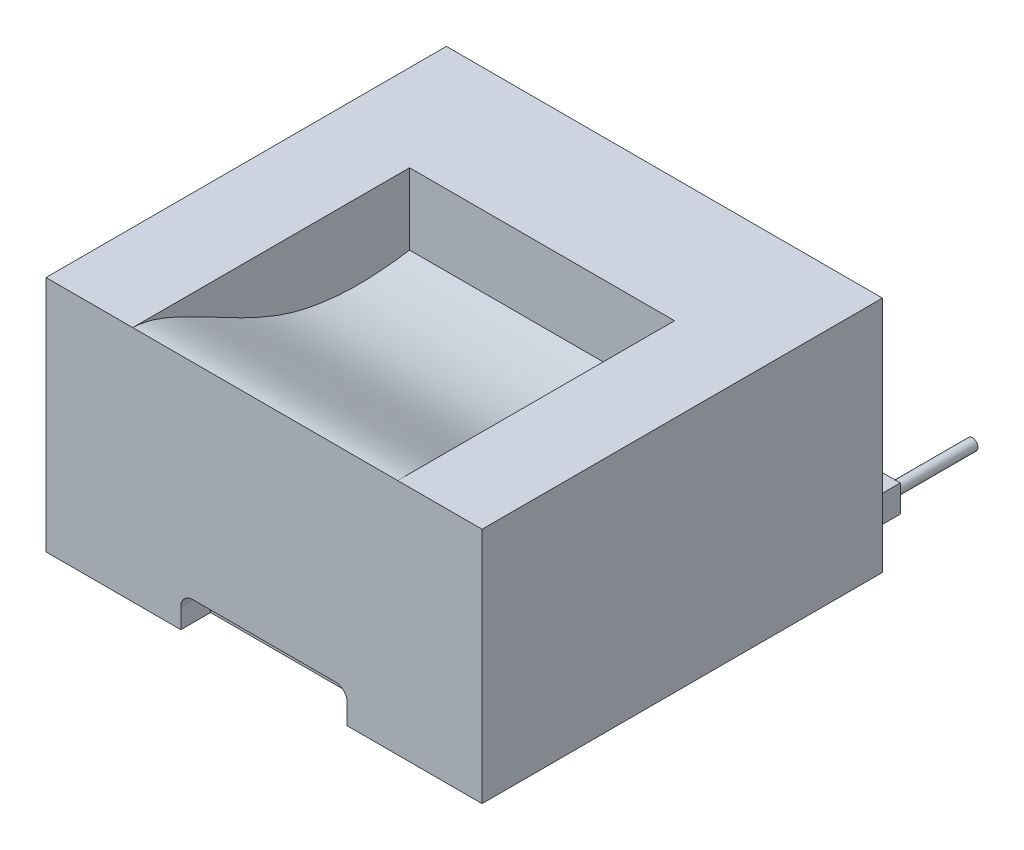
ISO-10303-21;
HEADER;
FILE_DESCRIPTION(('STEP AP214'),'2;1');
FILE_NAME('part.step','',(''),(''),'','','');
FILE_SCHEMA(('AUTOMOTIVE_DESIGN { 1 0 10303 214 1 1 1 1 }'));
ENDSEC;
DATA;
#1=APPLICATION_CONTEXT('core data for automotive mechanical design processes');
#2=APPLICATION_PROTOCOL_DEFINITION('international standard','automotive_design',2000,#1);
#3=PRODUCT_CONTEXT('',#1,'mechanical');
#4=PRODUCT('Part','Part','',(#3));
#5=PRODUCT_RELATED_PRODUCT_CATEGORY('part','',(#4));
#6=PRODUCT_DEFINITION_FORMATION('','',#4);
#7=PRODUCT_DEFINITION_CONTEXT('part definition',#1,'design');
#8=PRODUCT_DEFINITION('design','',#6,#7);
#9=PRODUCT_DEFINITION_SHAPE('','',#8);
#10=(LENGTH_UNIT() NAMED_UNIT(*) SI_UNIT(.MILLI.,.METRE.));
#11=(NAMED_UNIT(*) PLANE_ANGLE_UNIT() SI_UNIT($,.RADIAN.));
#12=(NAMED_UNIT(*) SI_UNIT($,.STERADIAN.) SOLID_ANGLE_UNIT());
#13=UNCERTAINTY_MEASURE_WITH_UNIT(LENGTH_MEASURE(1.E-05),#10,'distance_accuracy_value','');
#14=(GEOMETRIC_REPRESENTATION_CONTEXT(3) GLOBAL_UNCERTAINTY_ASSIGNED_CONTEXT((#13)) GLOBAL_UNIT_ASSIGNED_CONTEXT((#10,
#11,#12)) REPRESENTATION_CONTEXT('',''));
#15=CARTESIAN_POINT('',(0.,0.,0.));
#16=DIRECTION('',(0.,0.,1.));
#17=DIRECTION('',(1.,0.,0.));
#18=AXIS2_PLACEMENT_3D('',#15,#16,#17);
#19=CARTESIAN_POINT('',(0.,200.,0.));
#20=DIRECTION('',(0.,1.,0.));
#21=DIRECTION('',(0.,0.,1.));
#22=AXIS2_PLACEMENT_3D('',#19,#20,#21);
#23=PLANE('',#22);
#24=DIRECTION('',(1.,0.,0.));
#25=VECTOR('',#24,1.);
#26=CARTESIAN_POINT('',(-199.754231814552,200.,289.894753303738));
#27=LINE('',#26,#25);
#28=CARTESIAN_POINT('',(-199.754231814552,200.,289.894753303738));
#29=VERTEX_POINT('',#28);
#30=CARTESIAN_POINT('',(-126.754231814552,200.,289.894753303738));
#31=VERTEX_POINT('',#30);
#32=EDGE_CURVE('E361',#29,#31,#27,.T.);
#33=ORIENTED_EDGE('',*,*,#32,.T.);
#34=DIRECTION('',(0.,0.,1.));
#35=VECTOR('',#34,1.);
#36=CARTESIAN_POINT('',(-126.754231814552,200.,289.894753303738));
#37=LINE('',#36,#35);
#38=CARTESIAN_POINT('',(-126.754231814552,200.,56.8947533037381));
#39=VERTEX_POINT('',#38);
#40=EDGE_CURVE('E194',#39,#31,#37,.T.);
#41=ORIENTED_EDGE('',*,*,#40,.F.);
#42=DIRECTION('',(1.,0.,0.));
#43=VECTOR('',#42,1.);
#44=CARTESIAN_POINT('',(-126.754231814552,200.,56.8947533037381));
#45=LINE('',#44,#43);
#46=CARTESIAN_POINT('',(96.2457681854477,200.,56.8947533037381));
#47=VERTEX_POINT('',#46);
#48=EDGE_CURVE('E193',#39,#47,#45,.T.);
#49=ORIENTED_EDGE('',*,*,#48,.T.);
#50=DIRECTION('',(0.,0.,1.));
#51=VECTOR('',#50,1.);
#52=CARTESIAN_POINT('',(96.2457681854478,200.,289.894753303738));
#53=LINE('',#52,#51);
#54=CARTESIAN_POINT('',(96.2457681854477,200.,289.894753303738));
#55=VERTEX_POINT('',#54);
#56=EDGE_CURVE('E205',#47,#55,#53,.T.);
#57=ORIENTED_EDGE('',*,*,#56,.T.);
#58=CARTESIAN_POINT('',(167.245768185448,200.,289.894753303738));
#59=VERTEX_POINT('',#58);
#60=EDGE_CURVE('E366',#55,#59,#27,.T.);
#61=ORIENTED_EDGE('',*,*,#60,.T.);
#62=DIRECTION('',(0.,0.,-1.));
#63=VECTOR('',#62,1.);
#64=CARTESIAN_POINT('',(167.245768185448,200.,-47.1052466962619));
#65=LINE('',#64,#63);
#66=CARTESIAN_POINT('',(167.245768185448,200.,-47.1052466962619));
#67=VERTEX_POINT('',#66);
#68=EDGE_CURVE('E344',#59,#67,#65,.T.);
#69=ORIENTED_EDGE('',*,*,#68,.T.);
#70=DIRECTION('',(-1.,0.,0.));
#71=VECTOR('',#70,1.);
#72=CARTESIAN_POINT('',(-199.754231814552,200.,-47.1052466962619));
#73=LINE('',#72,#71);
#74=CARTESIAN_POINT('',(-199.754231814552,200.,-47.1052466962619));
#75=VERTEX_POINT('',#74);
#76=EDGE_CURVE('E336',#67,#75,#73,.T.);
#77=ORIENTED_EDGE('',*,*,#76,.T.);
#78=DIRECTION('',(0.,0.,1.));
#79=VECTOR('',#78,1.);
#80=CARTESIAN_POINT('',(-199.754231814552,200.,-47.1052466962619));
#81=LINE('',#80,#79);
#82=EDGE_CURVE('E331',#75,#29,#81,.T.);
#83=ORIENTED_EDGE('',*,*,#82,.T.);
#84=EDGE_LOOP('',(#33,#41,#49,#57,#61,#69,#77,#83));
#85=FACE_BOUND('',#84,.T.);
#86=ADVANCED_FACE('F40',(#85),#23,.T.);
#87=CARTESIAN_POINT('',(-199.754231814552,200.,-47.1052466962619));
#88=DIRECTION('',(0.,0.,1.));
#89=DIRECTION('',(1.,0.,0.));
#90=AXIS2_PLACEMENT_3D('',#87,#88,#89);
#91=PLANE('',#90);
#92=DIRECTION('',(0.,-1.,0.));
#93=VECTOR('',#92,1.);
#94=CARTESIAN_POINT('',(106.245768185448,0.,-47.1052466962619));
#95=LINE('',#94,#93);
#96=CARTESIAN_POINT('',(106.245768185448,47.,-47.1052466962619));
#97=VERTEX_POINT('',#96);
#98=CARTESIAN_POINT('',(106.245768185448,0.,-47.1052466962619));
#99=VERTEX_POINT('',#98);
#100=EDGE_CURVE('E355',#97,#99,#95,.T.);
#101=ORIENTED_EDGE('',*,*,#100,.F.);
#102=DIRECTION('',(1.,0.,0.));
#103=VECTOR('',#102,1.);
#104=CARTESIAN_POINT('',(106.245768185448,47.,-47.1052466962619));
#105=LINE('',#104,#103);
#106=CARTESIAN_POINT('',(-138.754231814552,47.,-47.1052466962619));
#107=VERTEX_POINT('',#106);
#108=EDGE_CURVE('E379',#107,#97,#105,.T.);
#109=ORIENTED_EDGE('',*,*,#108,.F.);
#110=DIRECTION('',(0.,1.,0.));
#111=VECTOR('',#110,1.);
#112=CARTESIAN_POINT('',(-138.754231814552,0.,-47.1052466962619));
#113=LINE('',#112,#111);
#114=CARTESIAN_POINT('',(-138.754231814552,0.,-47.1052466962619));
#115=VERTEX_POINT('',#114);
#116=EDGE_CURVE('E382',#115,#107,#113,.T.);
#117=ORIENTED_EDGE('',*,*,#116,.F.);
#118=DIRECTION('',(-1.,0.,0.));
#119=VECTOR('',#118,1.);
#120=CARTESIAN_POINT('',(-199.754231814552,0.,-47.1052466962619));
#121=LINE('',#120,#119);
#122=CARTESIAN_POINT('',(-199.754231814552,0.,-47.1052466962619));
#123=VERTEX_POINT('',#122);
#124=EDGE_CURVE('E323',#115,#123,#121,.T.);
#125=ORIENTED_EDGE('',*,*,#124,.T.);
#126=DIRECTION('',(0.,-1.,0.));
#127=VECTOR('',#126,1.);
#128=CARTESIAN_POINT('',(-199.754231814552,200.,-47.1052466962619));
#129=LINE('',#128,#127);
#130=EDGE_CURVE('E332',#75,#123,#129,.T.);
#131=ORIENTED_EDGE('',*,*,#130,.F.);
#132=ORIENTED_EDGE('',*,*,#76,.F.);
#133=DIRECTION('',(0.,-1.,0.));
#134=VECTOR('',#133,1.);
#135=CARTESIAN_POINT('',(167.245768185448,200.,-47.1052466962619));
#136=LINE('',#135,#134);
#137=CARTESIAN_POINT('',(167.245768185448,0.,-47.1052466962619));
#138=VERTEX_POINT('',#137);
#139=EDGE_CURVE('E335',#67,#138,#136,.T.);
#140=ORIENTED_EDGE('',*,*,#139,.T.);
#141=EDGE_CURVE('E329',#138,#99,#121,.T.);
#142=ORIENTED_EDGE('',*,*,#141,.T.);
#143=EDGE_LOOP('',(#101,#109,#117,#125,#131,#132,#140,#142));
#144=FACE_BOUND('',#143,.T.);
#145=DIRECTION('',(0.,-1.,0.));
#146=VECTOR('',#145,1.);
#147=CARTESIAN_POINT('',(147.245768185448,37.759447516328,-47.1052466962619));
#148=LINE('',#147,#146);
#149=CARTESIAN_POINT('',(147.245768185448,37.759447516328,-47.1052466962619));
#150=VERTEX_POINT('',#149);
#151=CARTESIAN_POINT('',(147.245768185448,15.,-47.1052466962619));
#152=VERTEX_POINT('',#151);
#153=EDGE_CURVE('E416',#150,#152,#148,.T.);
#154=ORIENTED_EDGE('',*,*,#153,.F.);
#155=DIRECTION('',(1.,0.,0.));
#156=VECTOR('',#155,1.);
#157=CARTESIAN_POINT('',(147.245768185448,37.759447516328,-47.1052466962619));
#158=LINE('',#157,#156);
#159=CARTESIAN_POINT('',(128.741820149761,37.759447516328,-47.1052466962619));
#160=VERTEX_POINT('',#159);
#161=EDGE_CURVE('E406',#160,#150,#158,.T.);
#162=ORIENTED_EDGE('',*,*,#161,.F.);
#163=DIRECTION('',(0.,1.,0.));
#164=VECTOR('',#163,1.);
#165=CARTESIAN_POINT('',(128.741820149761,37.759447516328,-47.1052466962619));
#166=LINE('',#165,#164);
#167=CARTESIAN_POINT('',(128.741820149761,15.,-47.1052466962619));
#168=VERTEX_POINT('',#167);
#169=EDGE_CURVE('E410',#168,#160,#166,.T.);
#170=ORIENTED_EDGE('',*,*,#169,.F.);
#171=DIRECTION('',(-1.,0.,0.));
#172=VECTOR('',#171,1.);
#173=CARTESIAN_POINT('',(147.245768185448,15.,-47.1052466962619));
#174=LINE('',#173,#172);
#175=EDGE_CURVE('E413',#152,#168,#174,.T.);
#176=ORIENTED_EDGE('',*,*,#175,.F.);
#177=EDGE_LOOP('',(#154,#162,#170,#176));
#178=FACE_BOUND('',#177,.T.);
#179=ADVANCED_FACE('F292',(#144,#178),#91,.F.);
#180=CARTESIAN_POINT('',(-199.754231814552,200.,-47.1052466962619));
#181=DIRECTION('',(1.,0.,0.));
#182=DIRECTION('',(0.,0.,-1.));
#183=AXIS2_PLACEMENT_3D('',#180,#181,#182);
#184=PLANE('',#183);
#185=DIRECTION('',(0.,0.,1.));
#186=VECTOR('',#185,1.);
#187=CARTESIAN_POINT('',(-199.754231814552,0.,-47.1052466962619));
#188=LINE('',#187,#186);
#189=CARTESIAN_POINT('',(-199.754231814552,0.,289.894753303738));
#190=VERTEX_POINT('',#189);
#191=EDGE_CURVE('E325',#123,#190,#188,.T.);
#192=ORIENTED_EDGE('',*,*,#191,.T.);
#193=DIRECTION('',(0.,-1.,0.));
#194=VECTOR('',#193,1.);
#195=CARTESIAN_POINT('',(-199.754231814552,200.,289.894753303738));
#196=LINE('',#195,#194);
#197=EDGE_CURVE('E44',#29,#190,#196,.T.);
#198=ORIENTED_EDGE('',*,*,#197,.F.);
#199=ORIENTED_EDGE('',*,*,#82,.F.);
#200=ORIENTED_EDGE('',*,*,#130,.T.);
#201=EDGE_LOOP('',(#192,#198,#199,#200));
#202=FACE_BOUND('',#201,.T.);
#203=ADVANCED_FACE('F42',(#202),#184,.F.);
#204=CARTESIAN_POINT('',(-199.754231814552,200.,289.894753303738));
#205=DIRECTION('',(0.,0.,-1.));
#206=DIRECTION('',(-1.,0.,0.));
#207=AXIS2_PLACEMENT_3D('',#204,#205,#206);
#208=PLANE('',#207);
#209=DIRECTION('',(1.,0.,0.));
#210=VECTOR('',#209,1.);
#211=CARTESIAN_POINT('',(-199.754231814552,0.,289.894753303738));
#212=LINE('',#211,#210);
#213=CARTESIAN_POINT('',(-86.2542318145522,0.,289.894753303738));
#214=VERTEX_POINT('',#213);
#215=EDGE_CURVE('E313',#190,#214,#212,.T.);
#216=ORIENTED_EDGE('',*,*,#215,.T.);
#217=DIRECTION('',(0.,-1.,0.));
#218=VECTOR('',#217,1.);
#219=CARTESIAN_POINT('',(-86.2542318145522,0.,289.894753303738));
#220=LINE('',#219,#218);
#221=CARTESIAN_POINT('',(-86.2542318145522,16.9999999999999,289.894753303738));
#222=VERTEX_POINT('',#221);
#223=EDGE_CURVE('E315',#222,#214,#220,.T.);
#224=ORIENTED_EDGE('',*,*,#223,.F.);
#225=CARTESIAN_POINT('',(-76.2542318145522,17.,289.894753303738));
#226=DIRECTION('',(0.,0.,1.));
#227=DIRECTION('',(-1.,0.,0.));
#228=AXIS2_PLACEMENT_3D('',#225,#226,#227);
#229=CIRCLE('',#228,10.);
#230=CARTESIAN_POINT('',(-76.2542318145522,27.,289.894753303738));
#231=VERTEX_POINT('',#230);
#232=EDGE_CURVE('E442',#231,#222,#229,.T.);
#233=ORIENTED_EDGE('',*,*,#232,.F.);
#234=DIRECTION('',(-1.,0.,0.));
#235=VECTOR('',#234,1.);
#236=CARTESIAN_POINT('',(-76.2542318145522,27.,289.894753303738));
#237=LINE('',#236,#235);
#238=CARTESIAN_POINT('',(43.7457681854477,27.,289.894753303738));
#239=VERTEX_POINT('',#238);
#240=EDGE_CURVE('E445',#239,#231,#237,.T.);
#241=ORIENTED_EDGE('',*,*,#240,.F.);
#242=CARTESIAN_POINT('',(43.7457681854478,17.,289.894753303738));
#243=DIRECTION('',(0.,0.,1.));
#244=DIRECTION('',(-1.,0.,0.));
#245=AXIS2_PLACEMENT_3D('',#242,#243,#244);
#246=CIRCLE('',#245,10.);
#247=CARTESIAN_POINT('',(53.7457681854478,16.9999999999999,289.894753303738));
#248=VERTEX_POINT('',#247);
#249=EDGE_CURVE('E448',#248,#239,#246,.T.);
#250=ORIENTED_EDGE('',*,*,#249,.F.);
#251=DIRECTION('',(0.,1.,0.));
#252=VECTOR('',#251,1.);
#253=CARTESIAN_POINT('',(53.7457681854478,0.,289.894753303738));
#254=LINE('',#253,#252);
#255=CARTESIAN_POINT('',(53.7457681854478,0.,289.894753303738));
#256=VERTEX_POINT('',#255);
#257=EDGE_CURVE('E451',#256,#248,#254,.T.);
#258=ORIENTED_EDGE('',*,*,#257,.F.);
#259=CARTESIAN_POINT('',(167.245768185448,0.,289.894753303738));
#260=VERTEX_POINT('',#259);
#261=EDGE_CURVE('E321',#256,#260,#212,.T.);
#262=ORIENTED_EDGE('',*,*,#261,.T.);
#263=DIRECTION('',(0.,-1.,0.));
#264=VECTOR('',#263,1.);
#265=CARTESIAN_POINT('',(167.245768185448,200.,289.894753303738));
#266=LINE('',#265,#264);
#267=EDGE_CURVE('E338',#59,#260,#266,.T.);
#268=ORIENTED_EDGE('',*,*,#267,.F.);
#269=ORIENTED_EDGE('',*,*,#60,.F.);
#270=DIRECTION('',(1.,0.,0.));
#271=VECTOR('',#270,1.);
#272=CARTESIAN_POINT('',(-126.754231814552,200.,289.894753303738));
#273=LINE('',#272,#271);
#274=EDGE_CURVE('E455',#31,#55,#273,.T.);
#275=ORIENTED_EDGE('',*,*,#274,.F.);
#276=ORIENTED_EDGE('',*,*,#32,.F.);
#277=ORIENTED_EDGE('',*,*,#197,.T.);
#278=EDGE_LOOP('',(#216,#224,#233,#241,#250,#258,#262,#268,#269,#275,#276,#277));
#279=FACE_BOUND('',#278,.T.);
#280=ADVANCED_FACE('F302',(#279),#208,.F.);
#281=CARTESIAN_POINT('',(167.245768185448,200.,-47.1052466962619));
#282=DIRECTION('',(-1.,0.,0.));
#283=DIRECTION('',(0.,0.,1.));
#284=AXIS2_PLACEMENT_3D('',#281,#282,#283);
#285=PLANE('',#284);
#286=DIRECTION('',(0.,0.,-1.));
#287=VECTOR('',#286,1.);
#288=CARTESIAN_POINT('',(167.245768185448,0.,-47.1052466962619));
#289=LINE('',#288,#287);
#290=EDGE_CURVE('E320',#260,#138,#289,.T.);
#291=ORIENTED_EDGE('',*,*,#290,.T.);
#292=ORIENTED_EDGE('',*,*,#139,.F.);
#293=ORIENTED_EDGE('',*,*,#68,.F.);
#294=ORIENTED_EDGE('',*,*,#267,.T.);
#295=EDGE_LOOP('',(#291,#292,#293,#294));
#296=FACE_BOUND('',#295,.T.);
#297=ADVANCED_FACE('F296',(#296),#285,.F.);
#298=CARTESIAN_POINT('',(0.,0.,0.));
#299=DIRECTION('',(0.,1.,0.));
#300=DIRECTION('',(0.,0.,1.));
#301=AXIS2_PLACEMENT_3D('',#298,#299,#300);
#302=PLANE('',#301);
#303=DIRECTION('',(1.,0.,0.));
#304=VECTOR('',#303,1.);
#305=CARTESIAN_POINT('',(-86.2542318145522,0.,264.894753303738));
#306=LINE('',#305,#304);
#307=CARTESIAN_POINT('',(-86.2542318145522,0.,264.894753303738));
#308=VERTEX_POINT('',#307);
#309=CARTESIAN_POINT('',(53.7457681854478,0.,264.894753303738));
#310=VERTEX_POINT('',#309);
#311=EDGE_CURVE('E466',#308,#310,#306,.T.);
#312=ORIENTED_EDGE('',*,*,#311,.F.);
#313=DIRECTION('',(0.,0.,1.));
#314=VECTOR('',#313,1.);
#315=CARTESIAN_POINT('',(-86.2542318145522,0.,264.894753303738));
#316=LINE('',#315,#314);
#317=EDGE_CURVE('E430',#308,#214,#316,.T.);
#318=ORIENTED_EDGE('',*,*,#317,.T.);
#319=ORIENTED_EDGE('',*,*,#215,.F.);
#320=ORIENTED_EDGE('',*,*,#191,.F.);
#321=ORIENTED_EDGE('',*,*,#124,.F.);
#322=DIRECTION('',(0.,0.,1.));
#323=VECTOR('',#322,1.);
#324=CARTESIAN_POINT('',(-138.754231814552,0.,-94.1052466962619));
#325=LINE('',#324,#323);
#326=CARTESIAN_POINT('',(-138.754231814552,0.,-94.1052466962619));
#327=VERTEX_POINT('',#326);
#328=EDGE_CURVE('E369',#327,#115,#325,.T.);
#329=ORIENTED_EDGE('',*,*,#328,.F.);
#330=DIRECTION('',(-1.,0.,0.));
#331=VECTOR('',#330,1.);
#332=CARTESIAN_POINT('',(106.245768185448,0.,-94.1052466962619));
#333=LINE('',#332,#331);
#334=CARTESIAN_POINT('',(106.245768185448,0.,-94.1052466962619));
#335=VERTEX_POINT('',#334);
#336=EDGE_CURVE('E390',#335,#327,#333,.T.);
#337=ORIENTED_EDGE('',*,*,#336,.F.);
#338=DIRECTION('',(0.,0.,1.));
#339=VECTOR('',#338,1.);
#340=CARTESIAN_POINT('',(106.245768185448,0.,-94.1052466962619));
#341=LINE('',#340,#339);
#342=EDGE_CURVE('E352',#335,#99,#341,.T.);
#343=ORIENTED_EDGE('',*,*,#342,.T.);
#344=ORIENTED_EDGE('',*,*,#141,.F.);
#345=ORIENTED_EDGE('',*,*,#290,.F.);
#346=ORIENTED_EDGE('',*,*,#261,.F.);
#347=DIRECTION('',(0.,0.,1.));
#348=VECTOR('',#347,1.);
#349=CARTESIAN_POINT('',(53.7457681854478,0.,264.894753303738));
#350=LINE('',#349,#348);
#351=EDGE_CURVE('E432',#310,#256,#350,.T.);
#352=ORIENTED_EDGE('',*,*,#351,.F.);
#353=EDGE_LOOP('',(#312,#318,#319,#320,#321,#329,#337,#343,#344,#345,#346,#352));
#354=FACE_BOUND('',#353,.T.);
#355=ADVANCED_FACE('F288',(#354),#302,.F.);
#356=CARTESIAN_POINT('',(106.245768185448,0.,-94.1052466962619));
#357=DIRECTION('',(-1.,0.,0.));
#358=DIRECTION('',(0.,-1.,0.));
#359=AXIS2_PLACEMENT_3D('',#356,#357,#358);
#360=PLANE('',#359);
#361=ORIENTED_EDGE('',*,*,#100,.T.);
#362=ORIENTED_EDGE('',*,*,#342,.F.);
#363=DIRECTION('',(0.,-1.,0.));
#364=VECTOR('',#363,1.);
#365=CARTESIAN_POINT('',(106.245768185448,0.,-94.1052466962619));
#366=LINE('',#365,#364);
#367=CARTESIAN_POINT('',(106.245768185448,47.,-94.1052466962619));
#368=VERTEX_POINT('',#367);
#369=EDGE_CURVE('E381',#368,#335,#366,.T.);
#370=ORIENTED_EDGE('',*,*,#369,.F.);
#371=DIRECTION('',(0.,0.,1.));
#372=VECTOR('',#371,1.);
#373=CARTESIAN_POINT('',(106.245768185448,47.,-94.1052466962619));
#374=LINE('',#373,#372);
#375=EDGE_CURVE('E375',#368,#97,#374,.T.);
#376=ORIENTED_EDGE('',*,*,#375,.T.);
#377=EDGE_LOOP('',(#361,#362,#370,#376));
#378=FACE_BOUND('',#377,.T.);
#379=ADVANCED_FACE('F284',(#378),#360,.F.);
#380=CARTESIAN_POINT('',(-138.754231814552,0.,-94.1052466962619));
#381=DIRECTION('',(1.,0.,0.));
#382=DIRECTION('',(0.,1.,0.));
#383=AXIS2_PLACEMENT_3D('',#380,#381,#382);
#384=PLANE('',#383);
#385=ORIENTED_EDGE('',*,*,#116,.T.);
#386=DIRECTION('',(0.,0.,1.));
#387=VECTOR('',#386,1.);
#388=CARTESIAN_POINT('',(-138.754231814552,47.,-94.1052466962619));
#389=LINE('',#388,#387);
#390=CARTESIAN_POINT('',(-138.754231814552,47.,-94.1052466962619));
#391=VERTEX_POINT('',#390);
#392=EDGE_CURVE('E372',#391,#107,#389,.T.);
#393=ORIENTED_EDGE('',*,*,#392,.F.);
#394=DIRECTION('',(0.,1.,0.));
#395=VECTOR('',#394,1.);
#396=CARTESIAN_POINT('',(-138.754231814552,0.,-94.1052466962619));
#397=LINE('',#396,#395);
#398=EDGE_CURVE('E388',#327,#391,#397,.T.);
#399=ORIENTED_EDGE('',*,*,#398,.F.);
#400=ORIENTED_EDGE('',*,*,#328,.T.);
#401=EDGE_LOOP('',(#385,#393,#399,#400));
#402=FACE_BOUND('',#401,.T.);
#403=ADVANCED_FACE('F280',(#402),#384,.F.);
#404=CARTESIAN_POINT('',(106.245768185448,47.,-94.1052466962619));
#405=DIRECTION('',(0.,-1.,0.));
#406=DIRECTION('',(1.,0.,0.));
#407=AXIS2_PLACEMENT_3D('',#404,#405,#406);
#408=PLANE('',#407);
#409=ORIENTED_EDGE('',*,*,#108,.T.);
#410=ORIENTED_EDGE('',*,*,#375,.F.);
#411=DIRECTION('',(1.,0.,0.));
#412=VECTOR('',#411,1.);
#413=CARTESIAN_POINT('',(106.245768185448,47.,-94.1052466962619));
#414=LINE('',#413,#412);
#415=EDGE_CURVE('E378',#391,#368,#414,.T.);
#416=ORIENTED_EDGE('',*,*,#415,.F.);
#417=ORIENTED_EDGE('',*,*,#392,.T.);
#418=EDGE_LOOP('',(#409,#410,#416,#417));
#419=FACE_BOUND('',#418,.T.);
#420=ADVANCED_FACE('F276',(#419),#408,.F.);
#421=CARTESIAN_POINT('',(0.,0.,-94.1052466962619));
#422=DIRECTION('',(0.,0.,1.));
#423=DIRECTION('',(1.,0.,0.));
#424=AXIS2_PLACEMENT_3D('',#421,#422,#423);
#425=PLANE('',#424);
#426=ORIENTED_EDGE('',*,*,#369,.T.);
#427=ORIENTED_EDGE('',*,*,#336,.T.);
#428=ORIENTED_EDGE('',*,*,#398,.T.);
#429=ORIENTED_EDGE('',*,*,#415,.T.);
#430=EDGE_LOOP('',(#426,#427,#428,#429));
#431=FACE_BOUND('',#430,.T.);
#432=ADVANCED_FACE('F272',(#431),#425,.F.);
#433=CARTESIAN_POINT('',(147.245768185448,37.759447516328,-82.1052466962619));
#434=DIRECTION('',(-1.,0.,0.));
#435=DIRECTION('',(0.,0.,1.));
#436=AXIS2_PLACEMENT_3D('',#433,#434,#435);
#437=PLANE('',#436);
#438=ORIENTED_EDGE('',*,*,#153,.T.);
#439=DIRECTION('',(0.,0.,1.));
#440=VECTOR('',#439,1.);
#441=CARTESIAN_POINT('',(147.245768185448,15.,-82.1052466962619));
#442=LINE('',#441,#440);
#443=CARTESIAN_POINT('',(147.245768185448,15.,-82.1052466962619));
#444=VERTEX_POINT('',#443);
#445=EDGE_CURVE('E386',#444,#152,#442,.T.);
#446=ORIENTED_EDGE('',*,*,#445,.F.);
#447=DIRECTION('',(0.,-1.,0.));
#448=VECTOR('',#447,1.);
#449=CARTESIAN_POINT('',(147.245768185448,37.759447516328,-82.1052466962619));
#450=LINE('',#449,#448);
#451=CARTESIAN_POINT('',(147.245768185448,37.759447516328,-82.1052466962619));
#452=VERTEX_POINT('',#451);
#453=EDGE_CURVE('E409',#452,#444,#450,.T.);
#454=ORIENTED_EDGE('',*,*,#453,.F.);
#455=DIRECTION('',(0.,0.,1.));
#456=VECTOR('',#455,1.);
#457=CARTESIAN_POINT('',(147.245768185448,37.759447516328,-82.1052466962619));
#458=LINE('',#457,#456);
#459=EDGE_CURVE('E402',#452,#150,#458,.T.);
#460=ORIENTED_EDGE('',*,*,#459,.T.);
#461=EDGE_LOOP('',(#438,#446,#454,#460));
#462=FACE_BOUND('',#461,.T.);
#463=ADVANCED_FACE('F268',(#462),#437,.F.);
#464=CARTESIAN_POINT('',(147.245768185448,15.,-82.1052466962619));
#465=DIRECTION('',(0.,1.,0.));
#466=DIRECTION('',(0.,0.,1.));
#467=AXIS2_PLACEMENT_3D('',#464,#465,#466);
#468=PLANE('',#467);
#469=ORIENTED_EDGE('',*,*,#175,.T.);
#470=DIRECTION('',(0.,0.,1.));
#471=VECTOR('',#470,1.);
#472=CARTESIAN_POINT('',(128.741820149761,15.,-82.1052466962619));
#473=LINE('',#472,#471);
#474=CARTESIAN_POINT('',(128.741820149761,15.,-82.1052466962619));
#475=VERTEX_POINT('',#474);
#476=EDGE_CURVE('E396',#475,#168,#473,.T.);
#477=ORIENTED_EDGE('',*,*,#476,.F.);
#478=DIRECTION('',(-1.,0.,0.));
#479=VECTOR('',#478,1.);
#480=CARTESIAN_POINT('',(147.245768185448,15.,-82.1052466962619));
#481=LINE('',#480,#479);
#482=EDGE_CURVE('E423',#444,#475,#481,.T.);
#483=ORIENTED_EDGE('',*,*,#482,.F.);
#484=ORIENTED_EDGE('',*,*,#445,.T.);
#485=EDGE_LOOP('',(#469,#477,#483,#484));
#486=FACE_BOUND('',#485,.T.);
#487=ADVANCED_FACE('F264',(#486),#468,.F.);
#488=CARTESIAN_POINT('',(128.741820149761,37.759447516328,-82.1052466962619));
#489=DIRECTION('',(1.,0.,0.));
#490=DIRECTION('',(0.,0.,-1.));
#491=AXIS2_PLACEMENT_3D('',#488,#489,#490);
#492=PLANE('',#491);
#493=ORIENTED_EDGE('',*,*,#169,.T.);
#494=DIRECTION('',(0.,0.,1.));
#495=VECTOR('',#494,1.);
#496=CARTESIAN_POINT('',(128.741820149761,37.759447516328,-82.1052466962619));
#497=LINE('',#496,#495);
#498=CARTESIAN_POINT('',(128.741820149761,37.759447516328,-82.1052466962619));
#499=VERTEX_POINT('',#498);
#500=EDGE_CURVE('E399',#499,#160,#497,.T.);
#501=ORIENTED_EDGE('',*,*,#500,.F.);
#502=DIRECTION('',(0.,1.,0.));
#503=VECTOR('',#502,1.);
#504=CARTESIAN_POINT('',(128.741820149761,37.759447516328,-82.1052466962619));
#505=LINE('',#504,#503);
#506=EDGE_CURVE('E421',#475,#499,#505,.T.);
#507=ORIENTED_EDGE('',*,*,#506,.F.);
#508=ORIENTED_EDGE('',*,*,#476,.T.);
#509=EDGE_LOOP('',(#493,#501,#507,#508));
#510=FACE_BOUND('',#509,.T.);
#511=ADVANCED_FACE('F260',(#510),#492,.F.);
#512=CARTESIAN_POINT('',(147.245768185448,37.759447516328,-82.1052466962619));
#513=DIRECTION('',(0.,-1.,0.));
#514=DIRECTION('',(0.,0.,-1.));
#515=AXIS2_PLACEMENT_3D('',#512,#513,#514);
#516=PLANE('',#515);
#517=ORIENTED_EDGE('',*,*,#161,.T.);
#518=ORIENTED_EDGE('',*,*,#459,.F.);
#519=DIRECTION('',(1.,0.,0.));
#520=VECTOR('',#519,1.);
#521=CARTESIAN_POINT('',(147.245768185448,37.759447516328,-82.1052466962619));
#522=LINE('',#521,#520);
#523=EDGE_CURVE('E405',#499,#452,#522,.T.);
#524=ORIENTED_EDGE('',*,*,#523,.F.);
#525=ORIENTED_EDGE('',*,*,#500,.T.);
#526=EDGE_LOOP('',(#517,#518,#524,#525));
#527=FACE_BOUND('',#526,.T.);
#528=ADVANCED_FACE('F256',(#527),#516,.F.);
#529=CARTESIAN_POINT('',(0.,0.,-82.1052466962619));
#530=DIRECTION('',(0.,0.,-1.));
#531=DIRECTION('',(-1.,0.,0.));
#532=AXIS2_PLACEMENT_3D('',#529,#530,#531);
#533=PLANE('',#532);
#534=CARTESIAN_POINT('',(137.993794167604,26.379723758164,-82.1052466962619));
#535=DIRECTION('',(0.,0.,-1.));
#536=DIRECTION('',(-1.,0.,0.));
#537=AXIS2_PLACEMENT_3D('',#534,#535,#536);
#538=CIRCLE('',#537,4.68912263757735);
#539=CARTESIAN_POINT('',(133.304671530027,26.379723758164,-82.1052466962619));
#540=VERTEX_POINT('',#539);
#541=EDGE_CURVE('E11',#540,#540,#538,.T.);
#542=ORIENTED_EDGE('',*,*,#541,.F.);
#543=EDGE_LOOP('',(#542));
#544=FACE_BOUND('',#543,.T.);
#545=ORIENTED_EDGE('',*,*,#453,.T.);
#546=ORIENTED_EDGE('',*,*,#482,.T.);
#547=ORIENTED_EDGE('',*,*,#506,.T.);
#548=ORIENTED_EDGE('',*,*,#523,.T.);
#549=EDGE_LOOP('',(#545,#546,#547,#548));
#550=FACE_BOUND('',#549,.T.);
#551=ADVANCED_FACE('F252',(#544,#550),#533,.T.);
#552=CARTESIAN_POINT('',(137.993794167604,26.379723758164,-152.105246696262));
#553=DIRECTION('',(0.,0.,1.));
#554=DIRECTION('',(1.,0.,0.));
#555=AXIS2_PLACEMENT_3D('',#552,#553,#554);
#556=CYLINDRICAL_SURFACE('',#555,4.68912263757735);
#557=CARTESIAN_POINT('',(137.993794167604,26.379723758164,-152.105246696262));
#558=DIRECTION('',(0.,0.,-1.));
#559=DIRECTION('',(-1.,0.,0.));
#560=AXIS2_PLACEMENT_3D('',#557,#558,#559);
#561=CIRCLE('',#560,4.68912263757735);
#562=CARTESIAN_POINT('',(133.304671530027,26.379723758164,-152.105246696262));
#563=VERTEX_POINT('',#562);
#564=EDGE_CURVE('E419',#563,#563,#561,.T.);
#565=ORIENTED_EDGE('',*,*,#564,.F.);
#566=EDGE_LOOP('',(#565));
#567=FACE_BOUND('',#566,.T.);
#568=ORIENTED_EDGE('',*,*,#541,.T.);
#569=EDGE_LOOP('',(#568));
#570=FACE_BOUND('',#569,.T.);
#571=ADVANCED_FACE('F248',(#567,#570),#556,.T.);
#572=CARTESIAN_POINT('',(137.993794167604,26.379723758164,-152.105246696262));
#573=DIRECTION('',(0.,0.,-1.));
#574=DIRECTION('',(-1.,0.,0.));
#575=AXIS2_PLACEMENT_3D('',#572,#573,#574);
#576=PLANE('',#575);
#577=ORIENTED_EDGE('',*,*,#564,.T.);
#578=EDGE_LOOP('',(#577));
#579=FACE_BOUND('',#578,.T.);
#580=ADVANCED_FACE('F244',(#579),#576,.T.);
#581=CARTESIAN_POINT('',(-86.2542318145522,0.,264.894753303738));
#582=DIRECTION('',(-1.,0.,0.));
#583=DIRECTION('',(0.,0.,1.));
#584=AXIS2_PLACEMENT_3D('',#581,#582,#583);
#585=PLANE('',#584);
#586=ORIENTED_EDGE('',*,*,#223,.T.);
#587=ORIENTED_EDGE('',*,*,#317,.F.);
#588=DIRECTION('',(0.,-1.,0.));
#589=VECTOR('',#588,1.);
#590=CARTESIAN_POINT('',(-86.2542318145522,0.,264.894753303738));
#591=LINE('',#590,#589);
#592=CARTESIAN_POINT('',(-86.2542318145522,16.9999999999999,264.894753303738));
#593=VERTEX_POINT('',#592);
#594=EDGE_CURVE('E64',#593,#308,#591,.T.);
#595=ORIENTED_EDGE('',*,*,#594,.F.);
#596=DIRECTION('',(0.,0.,1.));
#597=VECTOR('',#596,1.);
#598=CARTESIAN_POINT('',(-86.2542318145522,16.9999999999999,264.894753303738));
#599=LINE('',#598,#597);
#600=EDGE_CURVE('E429',#593,#222,#599,.T.);
#601=ORIENTED_EDGE('',*,*,#600,.T.);
#602=EDGE_LOOP('',(#586,#587,#595,#601));
#603=FACE_BOUND('',#602,.T.);
#604=ADVANCED_FACE('F230',(#603),#585,.F.);
#605=CARTESIAN_POINT('',(-76.2542318145522,17.,264.894753303738));
#606=DIRECTION('',(0.,0.,1.));
#607=DIRECTION('',(1.,0.,0.));
#608=AXIS2_PLACEMENT_3D('',#605,#606,#607);
#609=CYLINDRICAL_SURFACE('',#608,10.);
#610=ORIENTED_EDGE('',*,*,#232,.T.);
#611=ORIENTED_EDGE('',*,*,#600,.F.);
#612=CARTESIAN_POINT('',(-76.2542318145522,17.,264.894753303738));
#613=DIRECTION('',(0.,0.,1.));
#614=DIRECTION('',(-1.,0.,0.));
#615=AXIS2_PLACEMENT_3D('',#612,#613,#614);
#616=CIRCLE('',#615,10.);
#617=CARTESIAN_POINT('',(-76.2542318145522,27.,264.894753303738));
#618=VERTEX_POINT('',#617);
#619=EDGE_CURVE('E433',#618,#593,#616,.T.);
#620=ORIENTED_EDGE('',*,*,#619,.F.);
#621=DIRECTION('',(0.,0.,1.));
#622=VECTOR('',#621,1.);
#623=CARTESIAN_POINT('',(-76.2542318145522,27.,264.894753303738));
#624=LINE('',#623,#622);
#625=EDGE_CURVE('E439',#618,#231,#624,.T.);
#626=ORIENTED_EDGE('',*,*,#625,.T.);
#627=EDGE_LOOP('',(#610,#611,#620,#626));
#628=FACE_BOUND('',#627,.T.);
#629=ADVANCED_FACE('F226',(#628),#609,.F.);
#630=CARTESIAN_POINT('',(-76.2542318145522,27.,264.894753303738));
#631=DIRECTION('',(0.,1.,0.));
#632=DIRECTION('',(0.,0.,1.));
#633=AXIS2_PLACEMENT_3D('',#630,#631,#632);
#634=PLANE('',#633);
#635=ORIENTED_EDGE('',*,*,#240,.T.);
#636=ORIENTED_EDGE('',*,*,#625,.F.);
#637=DIRECTION('',(-1.,0.,0.));
#638=VECTOR('',#637,1.);
#639=CARTESIAN_POINT('',(-76.2542318145522,27.,264.894753303738));
#640=LINE('',#639,#638);
#641=CARTESIAN_POINT('',(43.7457681854477,27.,264.894753303738));
#642=VERTEX_POINT('',#641);
#643=EDGE_CURVE('E457',#642,#618,#640,.T.);
#644=ORIENTED_EDGE('',*,*,#643,.F.);
#645=DIRECTION('',(0.,0.,1.));
#646=VECTOR('',#645,1.);
#647=CARTESIAN_POINT('',(43.7457681854477,27.,264.894753303738));
#648=LINE('',#647,#646);
#649=EDGE_CURVE('E437',#642,#239,#648,.T.);
#650=ORIENTED_EDGE('',*,*,#649,.T.);
#651=EDGE_LOOP('',(#635,#636,#644,#650));
#652=FACE_BOUND('',#651,.T.);
#653=ADVANCED_FACE('F229',(#652),#634,.F.);
#654=CARTESIAN_POINT('',(43.7457681854478,17.,264.894753303738));
#655=DIRECTION('',(0.,0.,1.));
#656=DIRECTION('',(1.,0.,0.));
#657=AXIS2_PLACEMENT_3D('',#654,#655,#656);
#658=CYLINDRICAL_SURFACE('',#657,10.);
#659=ORIENTED_EDGE('',*,*,#249,.T.);
#660=ORIENTED_EDGE('',*,*,#649,.F.);
#661=CARTESIAN_POINT('',(43.7457681854478,17.,264.894753303738));
#662=DIRECTION('',(0.,0.,1.));
#663=DIRECTION('',(-1.,0.,0.));
#664=AXIS2_PLACEMENT_3D('',#661,#662,#663);
#665=CIRCLE('',#664,10.);
#666=CARTESIAN_POINT('',(53.7457681854478,16.9999999999999,264.894753303738));
#667=VERTEX_POINT('',#666);
#668=EDGE_CURVE('E460',#667,#642,#665,.T.);
#669=ORIENTED_EDGE('',*,*,#668,.F.);
#670=DIRECTION('',(0.,0.,1.));
#671=VECTOR('',#670,1.);
#672=CARTESIAN_POINT('',(53.7457681854478,16.9999999999999,264.894753303738));
#673=LINE('',#672,#671);
#674=EDGE_CURVE('E435',#667,#248,#673,.T.);
#675=ORIENTED_EDGE('',*,*,#674,.T.);
#676=EDGE_LOOP('',(#659,#660,#669,#675));
#677=FACE_BOUND('',#676,.T.);
#678=ADVANCED_FACE('F234',(#677),#658,.F.);
#679=CARTESIAN_POINT('',(53.7457681854478,0.,264.894753303738));
#680=DIRECTION('',(1.,0.,0.));
#681=DIRECTION('',(0.,0.,-1.));
#682=AXIS2_PLACEMENT_3D('',#679,#680,#681);
#683=PLANE('',#682);
#684=ORIENTED_EDGE('',*,*,#257,.T.);
#685=ORIENTED_EDGE('',*,*,#674,.F.);
#686=DIRECTION('',(0.,1.,0.));
#687=VECTOR('',#686,1.);
#688=CARTESIAN_POINT('',(53.7457681854478,0.,264.894753303738));
#689=LINE('',#688,#687);
#690=EDGE_CURVE('E463',#310,#667,#689,.T.);
#691=ORIENTED_EDGE('',*,*,#690,.F.);
#692=ORIENTED_EDGE('',*,*,#351,.T.);
#693=EDGE_LOOP('',(#684,#685,#691,#692));
#694=FACE_BOUND('',#693,.T.);
#695=ADVANCED_FACE('F225',(#694),#683,.F.);
#696=CARTESIAN_POINT('',(-76.2542318145522,17.,264.894753303738));
#697=DIRECTION('',(0.,0.,-1.));
#698=DIRECTION('',(-1.,0.,0.));
#699=AXIS2_PLACEMENT_3D('',#696,#697,#698);
#700=PLANE('',#699);
#701=ORIENTED_EDGE('',*,*,#594,.T.);
#702=ORIENTED_EDGE('',*,*,#311,.T.);
#703=ORIENTED_EDGE('',*,*,#690,.T.);
#704=ORIENTED_EDGE('',*,*,#668,.T.);
#705=ORIENTED_EDGE('',*,*,#643,.T.);
#706=ORIENTED_EDGE('',*,*,#619,.T.);
#707=EDGE_LOOP('',(#701,#702,#703,#704,#705,#706));
#708=FACE_BOUND('',#707,.T.);
#709=ADVANCED_FACE('F221',(#708),#700,.F.);
#710=CARTESIAN_POINT('',(-126.754231814552,200.,289.894753303738));
#711=CARTESIAN_POINT('',(-126.754231814552,199.483070544366,255.905913973019));
#712=CARTESIAN_POINT('',(-126.754231814552,150.542684270892,195.675702753632));
#713=CARTESIAN_POINT('',(-126.754231814552,134.680175733057,111.630124678743));
#714=CARTESIAN_POINT('',(-126.754231814552,135.886366382212,84.5905039348724));
#715=CARTESIAN_POINT('',(-126.754231814552,140.,56.8947533037379));
#716=B_SPLINE_CURVE_WITH_KNOTS('',3,(#710,#711,#712,#713,#714,#715),.UNSPECIFIED.,.F.,.F.,(4,1,
1,4),(0.,0.585078831127396,0.685078831127396,1.),.UNSPECIFIED.);
#717=DIRECTION('',(1.,0.,0.));
#718=VECTOR('',#717,1.);
#719=SURFACE_OF_LINEAR_EXTRUSION('',#716,#718);
#720=CARTESIAN_POINT('',(96.2457681854478,200.,289.894753303738));
#721=CARTESIAN_POINT('',(96.2457681854478,199.483070544366,255.905913973019));
#722=CARTESIAN_POINT('',(96.2457681854477,150.542684270892,195.675702753632));
#723=CARTESIAN_POINT('',(96.2457681854477,134.680175733057,111.630124678743));
#724=CARTESIAN_POINT('',(96.2457681854477,135.886366382212,84.5905039348724));
#725=CARTESIAN_POINT('',(96.2457681854477,140.,56.8947533037379));
#726=B_SPLINE_CURVE_WITH_KNOTS('',3,(#720,#721,#722,#723,#724,#725),.UNSPECIFIED.,.F.,.F.,(4,1,
1,4),(0.,0.585078831127396,0.685078831127396,1.),.UNSPECIFIED.);
#727=CARTESIAN_POINT('',(96.2457681854477,140.,56.8947533037381));
#728=VERTEX_POINT('',#727);
#729=EDGE_CURVE('E56',#55,#728,#726,.T.);
#730=ORIENTED_EDGE('',*,*,#729,.T.);
#731=DIRECTION('',(1.,0.,0.));
#732=VECTOR('',#731,1.);
#733=CARTESIAN_POINT('',(-126.754231814552,140.,56.8947533037381));
#734=LINE('',#733,#732);
#735=CARTESIAN_POINT('',(-126.754231814552,140.,56.8947533037381));
#736=VERTEX_POINT('',#735);
#737=EDGE_CURVE('E186',#736,#728,#734,.T.);
#738=ORIENTED_EDGE('',*,*,#737,.F.);
#739=EDGE_CURVE('E190',#31,#736,#716,.T.);
#740=ORIENTED_EDGE('',*,*,#739,.F.);
#741=ORIENTED_EDGE('',*,*,#274,.T.);
#742=EDGE_LOOP('',(#730,#738,#740,#741));
#743=FACE_BOUND('',#742,.T.);
#744=ADVANCED_FACE('F188',(#743),#719,.F.);
#745=CARTESIAN_POINT('',(-126.754231814552,200.,56.8947533037381));
#746=DIRECTION('',(0.,0.,-1.));
#747=DIRECTION('',(-1.,0.,0.));
#748=AXIS2_PLACEMENT_3D('',#745,#746,#747);
#749=PLANE('',#748);
#750=DIRECTION('',(0.,1.,0.));
#751=VECTOR('',#750,1.);
#752=CARTESIAN_POINT('',(96.2457681854477,200.,56.8947533037381));
#753=LINE('',#752,#751);
#754=EDGE_CURVE('E208',#728,#47,#753,.T.);
#755=ORIENTED_EDGE('',*,*,#754,.T.);
#756=ORIENTED_EDGE('',*,*,#48,.F.);
#757=DIRECTION('',(0.,1.,0.));
#758=VECTOR('',#757,1.);
#759=CARTESIAN_POINT('',(-126.754231814552,200.,56.8947533037381));
#760=LINE('',#759,#758);
#761=EDGE_CURVE('E197',#736,#39,#760,.T.);
#762=ORIENTED_EDGE('',*,*,#761,.F.);
#763=ORIENTED_EDGE('',*,*,#737,.T.);
#764=EDGE_LOOP('',(#755,#756,#762,#763));
#765=FACE_BOUND('',#764,.T.);
#766=ADVANCED_FACE('F198',(#765),#749,.F.);
#767=CARTESIAN_POINT('',(-126.754231814552,151.327835665084,176.622344302375));
#768=DIRECTION('',(1.,0.,0.));
#769=DIRECTION('',(0.,1.,0.));
#770=AXIS2_PLACEMENT_3D('',#767,#768,#769);
#771=PLANE('',#770);
#772=ORIENTED_EDGE('',*,*,#739,.T.);
#773=ORIENTED_EDGE('',*,*,#761,.T.);
#774=ORIENTED_EDGE('',*,*,#40,.T.);
#775=EDGE_LOOP('',(#772,#773,#774));
#776=FACE_BOUND('',#775,.T.);
#777=ADVANCED_FACE('F203',(#776),#771,.T.);
#778=CARTESIAN_POINT('',(96.2457681854477,151.327835665084,176.622344302375));
#779=DIRECTION('',(1.,0.,0.));
#780=DIRECTION('',(0.,1.,0.));
#781=AXIS2_PLACEMENT_3D('',#778,#779,#780);
#782=PLANE('',#781);
#783=ORIENTED_EDGE('',*,*,#729,.F.);
#784=ORIENTED_EDGE('',*,*,#56,.F.);
#785=ORIENTED_EDGE('',*,*,#754,.F.);
#786=EDGE_LOOP('',(#783,#784,#785));
#787=FACE_BOUND('',#786,.T.);
#788=ADVANCED_FACE('F477',(#787),#782,.F.);
#789=CLOSED_SHELL('',(#86,#179,#203,#280,#297,#355,#379,#403,#420,#432,#463,#487,#511,#528,#551,
#571,#580,#604,#629,#653,#678,#695,#709,#744,#766,#777,#788));
#790=MANIFOLD_SOLID_BREP('B2',#789);
#791=ADVANCED_BREP_SHAPE_REPRESENTATION('',(#18,#790),#14);
#792=SHAPE_DEFINITION_REPRESENTATION(#9,#791);
ENDSEC;
END-ISO-10303-21;
